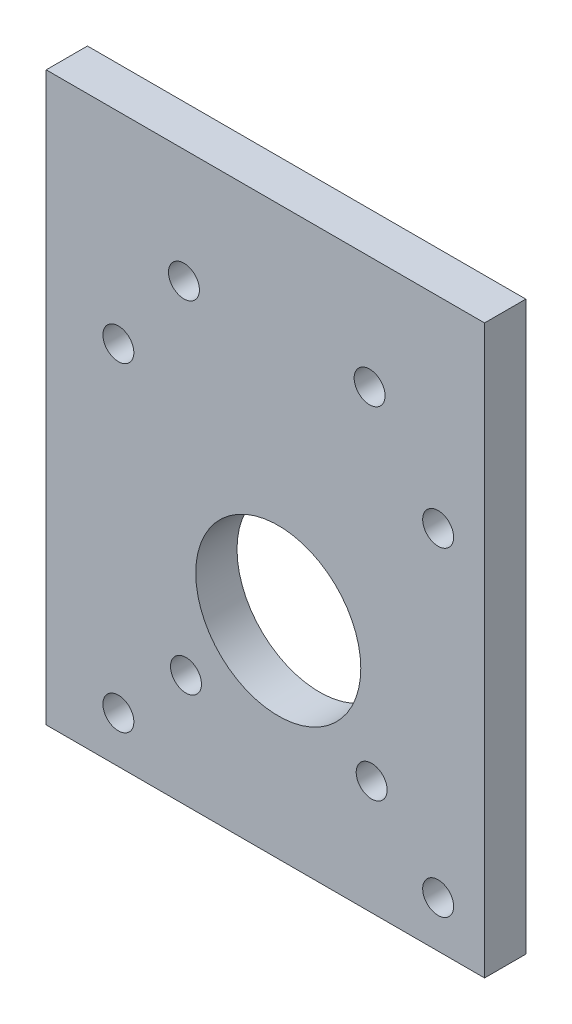
ISO-10303-21;
HEADER;
FILE_DESCRIPTION(('STEP AP214'),'2;1');
FILE_NAME('part.step','',(''),(''),'','','');
FILE_SCHEMA(('AUTOMOTIVE_DESIGN { 1 0 10303 214 1 1 1 1 }'));
ENDSEC;
DATA;
#1=APPLICATION_CONTEXT('core data for automotive mechanical design processes');
#2=APPLICATION_PROTOCOL_DEFINITION('international standard','automotive_design',2000,#1);
#3=PRODUCT_CONTEXT('',#1,'mechanical');
#4=PRODUCT('Part','Part','',(#3));
#5=PRODUCT_RELATED_PRODUCT_CATEGORY('part','',(#4));
#6=PRODUCT_DEFINITION_FORMATION('','',#4);
#7=PRODUCT_DEFINITION_CONTEXT('part definition',#1,'design');
#8=PRODUCT_DEFINITION('design','',#6,#7);
#9=PRODUCT_DEFINITION_SHAPE('','',#8);
#10=(LENGTH_UNIT() NAMED_UNIT(*) SI_UNIT(.MILLI.,.METRE.));
#11=(NAMED_UNIT(*) PLANE_ANGLE_UNIT() SI_UNIT($,.RADIAN.));
#12=(NAMED_UNIT(*) SI_UNIT($,.STERADIAN.) SOLID_ANGLE_UNIT());
#13=UNCERTAINTY_MEASURE_WITH_UNIT(LENGTH_MEASURE(1.E-05),#10,'distance_accuracy_value','');
#14=(GEOMETRIC_REPRESENTATION_CONTEXT(3) GLOBAL_UNCERTAINTY_ASSIGNED_CONTEXT((#13)) GLOBAL_UNIT_ASSIGNED_CONTEXT((#10,
#11,#12)) REPRESENTATION_CONTEXT('',''));
#15=CARTESIAN_POINT('',(0.,0.,0.));
#16=DIRECTION('',(0.,0.,1.));
#17=DIRECTION('',(1.,0.,0.));
#18=AXIS2_PLACEMENT_3D('',#15,#16,#17);
#19=CARTESIAN_POINT('',(21.25,20.,2.));
#20=DIRECTION('',(-1.,0.,0.));
#21=DIRECTION('',(0.,0.,1.));
#22=AXIS2_PLACEMENT_3D('',#19,#20,#21);
#23=PLANE('',#22);
#24=DIRECTION('',(0.,1.,0.));
#25=VECTOR('',#24,1.);
#26=CARTESIAN_POINT('',(21.25,20.,-2.));
#27=LINE('',#26,#25);
#28=CARTESIAN_POINT('',(21.25,-20.,-2.));
#29=VERTEX_POINT('',#28);
#30=CARTESIAN_POINT('',(21.25,35.,-2.));
#31=VERTEX_POINT('',#30);
#32=EDGE_CURVE('E153',#29,#31,#27,.T.);
#33=ORIENTED_EDGE('',*,*,#32,.T.);
#34=DIRECTION('',(0.,0.,-1.));
#35=VECTOR('',#34,1.);
#36=CARTESIAN_POINT('',(21.25,35.,-2.));
#37=LINE('',#36,#35);
#38=CARTESIAN_POINT('',(21.25,35.,2.));
#39=VERTEX_POINT('',#38);
#40=EDGE_CURVE('E99',#39,#31,#37,.T.);
#41=ORIENTED_EDGE('',*,*,#40,.F.);
#42=DIRECTION('',(0.,1.,0.));
#43=VECTOR('',#42,1.);
#44=CARTESIAN_POINT('',(21.25,20.,2.));
#45=LINE('',#44,#43);
#46=CARTESIAN_POINT('',(21.25,-20.,2.));
#47=VERTEX_POINT('',#46);
#48=EDGE_CURVE('E89',#47,#39,#45,.T.);
#49=ORIENTED_EDGE('',*,*,#48,.F.);
#50=DIRECTION('',(0.,0.,-1.));
#51=VECTOR('',#50,1.);
#52=CARTESIAN_POINT('',(21.25,-20.,2.));
#53=LINE('',#52,#51);
#54=EDGE_CURVE('E49',#47,#29,#53,.T.);
#55=ORIENTED_EDGE('',*,*,#54,.T.);
#56=EDGE_LOOP('',(#33,#41,#49,#55));
#57=FACE_BOUND('',#56,.T.);
#58=ADVANCED_FACE('F39',(#57),#23,.F.);
#59=CARTESIAN_POINT('',(-21.25,20.,2.));
#60=DIRECTION('',(1.,0.,0.));
#61=DIRECTION('',(0.,1.,0.));
#62=AXIS2_PLACEMENT_3D('',#59,#60,#61);
#63=PLANE('',#62);
#64=DIRECTION('',(0.,-1.,0.));
#65=VECTOR('',#64,1.);
#66=CARTESIAN_POINT('',(-21.25,20.,-2.));
#67=LINE('',#66,#65);
#68=CARTESIAN_POINT('',(-21.25,35.,-2.));
#69=VERTEX_POINT('',#68);
#70=CARTESIAN_POINT('',(-21.25,-20.,-2.));
#71=VERTEX_POINT('',#70);
#72=EDGE_CURVE('E69',#69,#71,#67,.T.);
#73=ORIENTED_EDGE('',*,*,#72,.T.);
#74=DIRECTION('',(0.,0.,-1.));
#75=VECTOR('',#74,1.);
#76=CARTESIAN_POINT('',(-21.25,-20.,2.));
#77=LINE('',#76,#75);
#78=CARTESIAN_POINT('',(-21.25,-20.,2.));
#79=VERTEX_POINT('',#78);
#80=EDGE_CURVE('E11',#79,#71,#77,.T.);
#81=ORIENTED_EDGE('',*,*,#80,.F.);
#82=DIRECTION('',(0.,-1.,0.));
#83=VECTOR('',#82,1.);
#84=CARTESIAN_POINT('',(-21.25,20.,2.));
#85=LINE('',#84,#83);
#86=CARTESIAN_POINT('',(-21.25,35.,2.));
#87=VERTEX_POINT('',#86);
#88=EDGE_CURVE('E83',#87,#79,#85,.T.);
#89=ORIENTED_EDGE('',*,*,#88,.F.);
#90=DIRECTION('',(0.,0.,1.));
#91=VECTOR('',#90,1.);
#92=CARTESIAN_POINT('',(-21.25,35.,-2.));
#93=LINE('',#92,#91);
#94=EDGE_CURVE('E87',#69,#87,#93,.T.);
#95=ORIENTED_EDGE('',*,*,#94,.F.);
#96=EDGE_LOOP('',(#73,#81,#89,#95));
#97=FACE_BOUND('',#96,.T.);
#98=ADVANCED_FACE('F85',(#97),#63,.F.);
#99=CARTESIAN_POINT('',(-21.25,-20.,2.));
#100=DIRECTION('',(0.,1.,0.));
#101=DIRECTION('',(0.,0.,1.));
#102=AXIS2_PLACEMENT_3D('',#99,#100,#101);
#103=PLANE('',#102);
#104=DIRECTION('',(1.,0.,0.));
#105=VECTOR('',#104,1.);
#106=CARTESIAN_POINT('',(-21.25,-20.,-2.));
#107=LINE('',#106,#105);
#108=EDGE_CURVE('E158',#71,#29,#107,.T.);
#109=ORIENTED_EDGE('',*,*,#108,.T.);
#110=ORIENTED_EDGE('',*,*,#54,.F.);
#111=DIRECTION('',(1.,0.,0.));
#112=VECTOR('',#111,1.);
#113=CARTESIAN_POINT('',(-21.25,-20.,2.));
#114=LINE('',#113,#112);
#115=EDGE_CURVE('E58',#79,#47,#114,.T.);
#116=ORIENTED_EDGE('',*,*,#115,.F.);
#117=ORIENTED_EDGE('',*,*,#80,.T.);
#118=EDGE_LOOP('',(#109,#110,#116,#117));
#119=FACE_BOUND('',#118,.T.);
#120=ADVANCED_FACE('F207',(#119),#103,.F.);
#121=CARTESIAN_POINT('',(0.,0.,2.));
#122=DIRECTION('',(0.,0.,1.));
#123=DIRECTION('',(1.,0.,0.));
#124=AXIS2_PLACEMENT_3D('',#121,#122,#123);
#125=PLANE('',#124);
#126=CARTESIAN_POINT('',(-7.69577181131252,-9.05390339576949,2.));
#127=DIRECTION('',(0.,0.,1.));
#128=DIRECTION('',(1.,0.,0.));
#129=AXIS2_PLACEMENT_3D('',#126,#127,#128);
#130=CIRCLE('',#129,1.5);
#131=CARTESIAN_POINT('',(-6.19577181131252,-9.05390339576949,2.));
#132=VERTEX_POINT('',#131);
#133=EDGE_CURVE('E371',#132,#132,#130,.T.);
#134=ORIENTED_EDGE('',*,*,#133,.F.);
#135=EDGE_LOOP('',(#134));
#136=FACE_BOUND('',#135,.T.);
#137=CARTESIAN_POINT('',(10.3039033957695,-8.94577181131251,2.));
#138=DIRECTION('',(0.,0.,1.));
#139=DIRECTION('',(1.,0.,0.));
#140=AXIS2_PLACEMENT_3D('',#137,#138,#139);
#141=CIRCLE('',#140,1.5);
#142=CARTESIAN_POINT('',(11.8039033957695,-8.94577181131251,2.));
#143=VERTEX_POINT('',#142);
#144=EDGE_CURVE('E367',#143,#143,#141,.T.);
#145=ORIENTED_EDGE('',*,*,#144,.F.);
#146=EDGE_LOOP('',(#145));
#147=FACE_BOUND('',#146,.T.);
#148=CARTESIAN_POINT('',(10.1056621575984,24.0536327350045,2.));
#149=DIRECTION('',(0.,0.,1.));
#150=DIRECTION('',(1.,0.,0.));
#151=AXIS2_PLACEMENT_3D('',#148,#149,#150);
#152=CIRCLE('',#151,1.5);
#153=CARTESIAN_POINT('',(11.6056621575984,24.0536327350045,2.));
#154=VERTEX_POINT('',#153);
#155=EDGE_CURVE('E364',#154,#154,#152,.T.);
#156=ORIENTED_EDGE('',*,*,#155,.F.);
#157=EDGE_LOOP('',(#156));
#158=FACE_BOUND('',#157,.T.);
#159=CARTESIAN_POINT('',(-7.89401304948366,23.9455011505475,2.));
#160=DIRECTION('',(0.,0.,1.));
#161=DIRECTION('',(1.,0.,0.));
#162=AXIS2_PLACEMENT_3D('',#159,#160,#161);
#163=CIRCLE('',#162,1.5);
#164=CARTESIAN_POINT('',(-6.39401304948366,23.9455011505475,2.));
#165=VERTEX_POINT('',#164);
#166=EDGE_CURVE('E109',#165,#165,#163,.T.);
#167=ORIENTED_EDGE('',*,*,#166,.F.);
#168=EDGE_LOOP('',(#167));
#169=FACE_BOUND('',#168,.T.);
#170=CARTESIAN_POINT('',(1.25,0.,2.));
#171=DIRECTION('',(0.,0.,1.));
#172=DIRECTION('',(1.,0.,0.));
#173=AXIS2_PLACEMENT_3D('',#170,#171,#172);
#174=CIRCLE('',#173,8.);
#175=CARTESIAN_POINT('',(9.25,0.,2.));
#176=VERTEX_POINT('',#175);
#177=EDGE_CURVE('E116',#176,#176,#174,.T.);
#178=ORIENTED_EDGE('',*,*,#177,.F.);
#179=EDGE_LOOP('',(#178));
#180=FACE_BOUND('',#179,.T.);
#181=CARTESIAN_POINT('',(16.75,-15.5,2.));
#182=DIRECTION('',(0.,0.,-1.));
#183=DIRECTION('',(-1.,0.,0.));
#184=AXIS2_PLACEMENT_3D('',#181,#182,#183);
#185=CIRCLE('',#184,1.5);
#186=CARTESIAN_POINT('',(15.25,-15.5,2.));
#187=VERTEX_POINT('',#186);
#188=EDGE_CURVE('E142',#187,#187,#185,.T.);
#189=ORIENTED_EDGE('',*,*,#188,.T.);
#190=EDGE_LOOP('',(#189));
#191=FACE_BOUND('',#190,.T.);
#192=CARTESIAN_POINT('',(-14.25,-15.5,2.));
#193=DIRECTION('',(0.,0.,-1.));
#194=DIRECTION('',(-1.,0.,0.));
#195=AXIS2_PLACEMENT_3D('',#192,#193,#194);
#196=CIRCLE('',#195,1.5);
#197=CARTESIAN_POINT('',(-15.75,-15.5,2.));
#198=VERTEX_POINT('',#197);
#199=EDGE_CURVE('E134',#198,#198,#196,.T.);
#200=ORIENTED_EDGE('',*,*,#199,.T.);
#201=EDGE_LOOP('',(#200));
#202=FACE_BOUND('',#201,.T.);
#203=CARTESIAN_POINT('',(-14.25,15.5,2.));
#204=DIRECTION('',(0.,0.,-1.));
#205=DIRECTION('',(-1.,0.,0.));
#206=AXIS2_PLACEMENT_3D('',#203,#204,#205);
#207=CIRCLE('',#206,1.5);
#208=CARTESIAN_POINT('',(-15.75,15.5,2.));
#209=VERTEX_POINT('',#208);
#210=EDGE_CURVE('E125',#209,#209,#207,.T.);
#211=ORIENTED_EDGE('',*,*,#210,.T.);
#212=EDGE_LOOP('',(#211));
#213=FACE_BOUND('',#212,.T.);
#214=CARTESIAN_POINT('',(16.75,15.5,2.));
#215=DIRECTION('',(0.,0.,-1.));
#216=DIRECTION('',(-1.,0.,0.));
#217=AXIS2_PLACEMENT_3D('',#214,#215,#216);
#218=CIRCLE('',#217,1.5);
#219=CARTESIAN_POINT('',(15.25,15.5,2.));
#220=VERTEX_POINT('',#219);
#221=EDGE_CURVE('E149',#220,#220,#218,.T.);
#222=ORIENTED_EDGE('',*,*,#221,.T.);
#223=EDGE_LOOP('',(#222));
#224=FACE_BOUND('',#223,.T.);
#225=ORIENTED_EDGE('',*,*,#48,.T.);
#226=DIRECTION('',(1.,0.,0.));
#227=VECTOR('',#226,1.);
#228=CARTESIAN_POINT('',(-21.25,35.,2.));
#229=LINE('',#228,#227);
#230=EDGE_CURVE('E92',#87,#39,#229,.T.);
#231=ORIENTED_EDGE('',*,*,#230,.F.);
#232=ORIENTED_EDGE('',*,*,#88,.T.);
#233=ORIENTED_EDGE('',*,*,#115,.T.);
#234=EDGE_LOOP('',(#225,#231,#232,#233));
#235=FACE_BOUND('',#234,.T.);
#236=ADVANCED_FACE('F93',(#136,#147,#158,#169,#180,#191,#202,#213,#224,#235),#125,.T.);
#237=CARTESIAN_POINT('',(0.,0.,-2.));
#238=DIRECTION('',(0.,0.,1.));
#239=DIRECTION('',(1.,0.,0.));
#240=AXIS2_PLACEMENT_3D('',#237,#238,#239);
#241=PLANE('',#240);
#242=CARTESIAN_POINT('',(-7.69577181131252,-9.05390339576949,-2.));
#243=DIRECTION('',(0.,0.,1.));
#244=DIRECTION('',(1.,0.,0.));
#245=AXIS2_PLACEMENT_3D('',#242,#243,#244);
#246=CIRCLE('',#245,1.5);
#247=CARTESIAN_POINT('',(-6.19577181131252,-9.05390339576949,-2.));
#248=VERTEX_POINT('',#247);
#249=EDGE_CURVE('E42',#248,#248,#246,.T.);
#250=ORIENTED_EDGE('',*,*,#249,.T.);
#251=EDGE_LOOP('',(#250));
#252=FACE_BOUND('',#251,.T.);
#253=CARTESIAN_POINT('',(10.3039033957695,-8.94577181131251,-2.));
#254=DIRECTION('',(0.,0.,1.));
#255=DIRECTION('',(1.,0.,0.));
#256=AXIS2_PLACEMENT_3D('',#253,#254,#255);
#257=CIRCLE('',#256,1.5);
#258=CARTESIAN_POINT('',(11.8039033957695,-8.94577181131251,-2.));
#259=VERTEX_POINT('',#258);
#260=EDGE_CURVE('E107',#259,#259,#257,.T.);
#261=ORIENTED_EDGE('',*,*,#260,.T.);
#262=EDGE_LOOP('',(#261));
#263=FACE_BOUND('',#262,.T.);
#264=CARTESIAN_POINT('',(10.1056621575984,24.0536327350045,-2.));
#265=DIRECTION('',(0.,0.,1.));
#266=DIRECTION('',(1.,0.,0.));
#267=AXIS2_PLACEMENT_3D('',#264,#265,#266);
#268=CIRCLE('',#267,1.5);
#269=CARTESIAN_POINT('',(11.6056621575984,24.0536327350045,-2.));
#270=VERTEX_POINT('',#269);
#271=EDGE_CURVE('E175',#270,#270,#268,.T.);
#272=ORIENTED_EDGE('',*,*,#271,.T.);
#273=EDGE_LOOP('',(#272));
#274=FACE_BOUND('',#273,.T.);
#275=CARTESIAN_POINT('',(-7.89401304948366,23.9455011505475,-2.));
#276=DIRECTION('',(0.,0.,1.));
#277=DIRECTION('',(1.,0.,0.));
#278=AXIS2_PLACEMENT_3D('',#275,#276,#277);
#279=CIRCLE('',#278,1.5);
#280=CARTESIAN_POINT('',(-6.39401304948366,23.9455011505475,-2.));
#281=VERTEX_POINT('',#280);
#282=EDGE_CURVE('E171',#281,#281,#279,.T.);
#283=ORIENTED_EDGE('',*,*,#282,.T.);
#284=EDGE_LOOP('',(#283));
#285=FACE_BOUND('',#284,.T.);
#286=CARTESIAN_POINT('',(1.25,0.,-2.));
#287=DIRECTION('',(0.,0.,1.));
#288=DIRECTION('',(1.,0.,0.));
#289=AXIS2_PLACEMENT_3D('',#286,#287,#288);
#290=CIRCLE('',#289,8.);
#291=CARTESIAN_POINT('',(9.25,0.,-2.));
#292=VERTEX_POINT('',#291);
#293=EDGE_CURVE('E117',#292,#292,#290,.T.);
#294=ORIENTED_EDGE('',*,*,#293,.T.);
#295=EDGE_LOOP('',(#294));
#296=FACE_BOUND('',#295,.T.);
#297=CARTESIAN_POINT('',(16.75,-15.5,-2.));
#298=DIRECTION('',(0.,0.,-1.));
#299=DIRECTION('',(-1.,0.,0.));
#300=AXIS2_PLACEMENT_3D('',#297,#298,#299);
#301=CIRCLE('',#300,1.5);
#302=CARTESIAN_POINT('',(15.25,-15.5,-2.));
#303=VERTEX_POINT('',#302);
#304=EDGE_CURVE('E121',#303,#303,#301,.T.);
#305=ORIENTED_EDGE('',*,*,#304,.F.);
#306=EDGE_LOOP('',(#305));
#307=FACE_BOUND('',#306,.T.);
#308=CARTESIAN_POINT('',(-14.25,-15.5,-2.));
#309=DIRECTION('',(0.,0.,-1.));
#310=DIRECTION('',(-1.,0.,0.));
#311=AXIS2_PLACEMENT_3D('',#308,#309,#310);
#312=CIRCLE('',#311,1.5);
#313=CARTESIAN_POINT('',(-15.75,-15.5,-2.));
#314=VERTEX_POINT('',#313);
#315=EDGE_CURVE('E138',#314,#314,#312,.T.);
#316=ORIENTED_EDGE('',*,*,#315,.F.);
#317=EDGE_LOOP('',(#316));
#318=FACE_BOUND('',#317,.T.);
#319=CARTESIAN_POINT('',(-14.25,15.5,-2.));
#320=DIRECTION('',(0.,0.,-1.));
#321=DIRECTION('',(-1.,0.,0.));
#322=AXIS2_PLACEMENT_3D('',#319,#320,#321);
#323=CIRCLE('',#322,1.5);
#324=CARTESIAN_POINT('',(-15.75,15.5,-2.));
#325=VERTEX_POINT('',#324);
#326=EDGE_CURVE('E130',#325,#325,#323,.T.);
#327=ORIENTED_EDGE('',*,*,#326,.F.);
#328=EDGE_LOOP('',(#327));
#329=FACE_BOUND('',#328,.T.);
#330=CARTESIAN_POINT('',(16.75,15.5,-2.));
#331=DIRECTION('',(0.,0.,-1.));
#332=DIRECTION('',(-1.,0.,0.));
#333=AXIS2_PLACEMENT_3D('',#330,#331,#332);
#334=CIRCLE('',#333,1.5);
#335=CARTESIAN_POINT('',(15.25,15.5,-2.));
#336=VERTEX_POINT('',#335);
#337=EDGE_CURVE('E129',#336,#336,#334,.T.);
#338=ORIENTED_EDGE('',*,*,#337,.F.);
#339=EDGE_LOOP('',(#338));
#340=FACE_BOUND('',#339,.T.);
#341=ORIENTED_EDGE('',*,*,#32,.F.);
#342=ORIENTED_EDGE('',*,*,#108,.F.);
#343=ORIENTED_EDGE('',*,*,#72,.F.);
#344=DIRECTION('',(-1.,0.,0.));
#345=VECTOR('',#344,1.);
#346=CARTESIAN_POINT('',(-21.25,35.,-2.));
#347=LINE('',#346,#345);
#348=EDGE_CURVE('E102',#31,#69,#347,.T.);
#349=ORIENTED_EDGE('',*,*,#348,.F.);
#350=EDGE_LOOP('',(#341,#342,#343,#349));
#351=FACE_BOUND('',#350,.T.);
#352=ADVANCED_FACE('F182',(#252,#263,#274,#285,#296,#307,#318,#329,#340,#351),#241,.F.);
#353=CARTESIAN_POINT('',(16.75,15.5,2.));
#354=DIRECTION('',(0.,0.,-1.));
#355=DIRECTION('',(-1.,0.,0.));
#356=AXIS2_PLACEMENT_3D('',#353,#354,#355);
#357=CYLINDRICAL_SURFACE('',#356,1.5);
#358=ORIENTED_EDGE('',*,*,#221,.F.);
#359=EDGE_LOOP('',(#358));
#360=FACE_BOUND('',#359,.T.);
#361=ORIENTED_EDGE('',*,*,#337,.T.);
#362=EDGE_LOOP('',(#361));
#363=FACE_BOUND('',#362,.T.);
#364=ADVANCED_FACE('F210',(#360,#363),#357,.F.);
#365=CARTESIAN_POINT('',(-14.25,15.5,2.));
#366=DIRECTION('',(0.,0.,-1.));
#367=DIRECTION('',(-1.,0.,0.));
#368=AXIS2_PLACEMENT_3D('',#365,#366,#367);
#369=CYLINDRICAL_SURFACE('',#368,1.5);
#370=ORIENTED_EDGE('',*,*,#210,.F.);
#371=EDGE_LOOP('',(#370));
#372=FACE_BOUND('',#371,.T.);
#373=ORIENTED_EDGE('',*,*,#326,.T.);
#374=EDGE_LOOP('',(#373));
#375=FACE_BOUND('',#374,.T.);
#376=ADVANCED_FACE('F217',(#372,#375),#369,.F.);
#377=CARTESIAN_POINT('',(-14.25,-15.5,2.));
#378=DIRECTION('',(0.,0.,-1.));
#379=DIRECTION('',(-1.,0.,0.));
#380=AXIS2_PLACEMENT_3D('',#377,#378,#379);
#381=CYLINDRICAL_SURFACE('',#380,1.5);
#382=ORIENTED_EDGE('',*,*,#199,.F.);
#383=EDGE_LOOP('',(#382));
#384=FACE_BOUND('',#383,.T.);
#385=ORIENTED_EDGE('',*,*,#315,.T.);
#386=EDGE_LOOP('',(#385));
#387=FACE_BOUND('',#386,.T.);
#388=ADVANCED_FACE('F244',(#384,#387),#381,.F.);
#389=CARTESIAN_POINT('',(16.75,-15.5,2.));
#390=DIRECTION('',(0.,0.,-1.));
#391=DIRECTION('',(-1.,0.,0.));
#392=AXIS2_PLACEMENT_3D('',#389,#390,#391);
#393=CYLINDRICAL_SURFACE('',#392,1.5);
#394=ORIENTED_EDGE('',*,*,#188,.F.);
#395=EDGE_LOOP('',(#394));
#396=FACE_BOUND('',#395,.T.);
#397=ORIENTED_EDGE('',*,*,#304,.T.);
#398=EDGE_LOOP('',(#397));
#399=FACE_BOUND('',#398,.T.);
#400=ADVANCED_FACE('F254',(#396,#399),#393,.F.);
#401=CARTESIAN_POINT('',(1.25,0.,-2.));
#402=DIRECTION('',(0.,0.,1.));
#403=DIRECTION('',(1.,0.,0.));
#404=AXIS2_PLACEMENT_3D('',#401,#402,#403);
#405=CYLINDRICAL_SURFACE('',#404,8.);
#406=ORIENTED_EDGE('',*,*,#293,.F.);
#407=EDGE_LOOP('',(#406));
#408=FACE_BOUND('',#407,.T.);
#409=ORIENTED_EDGE('',*,*,#177,.T.);
#410=EDGE_LOOP('',(#409));
#411=FACE_BOUND('',#410,.T.);
#412=ADVANCED_FACE('F264',(#408,#411),#405,.F.);
#413=CARTESIAN_POINT('',(0.,35.,0.));
#414=DIRECTION('',(0.,1.,0.));
#415=DIRECTION('',(0.,0.,1.));
#416=AXIS2_PLACEMENT_3D('',#413,#414,#415);
#417=PLANE('',#416);
#418=ORIENTED_EDGE('',*,*,#94,.T.);
#419=ORIENTED_EDGE('',*,*,#230,.T.);
#420=ORIENTED_EDGE('',*,*,#40,.T.);
#421=ORIENTED_EDGE('',*,*,#348,.T.);
#422=EDGE_LOOP('',(#418,#419,#420,#421));
#423=FACE_BOUND('',#422,.T.);
#424=ADVANCED_FACE('F101',(#423),#417,.T.);
#425=CARTESIAN_POINT('',(-7.89401304948366,23.9455011505475,-8.));
#426=DIRECTION('',(0.,0.,1.));
#427=DIRECTION('',(1.,0.,0.));
#428=AXIS2_PLACEMENT_3D('',#425,#426,#427);
#429=CYLINDRICAL_SURFACE('',#428,1.5);
#430=ORIENTED_EDGE('',*,*,#166,.T.);
#431=EDGE_LOOP('',(#430));
#432=FACE_BOUND('',#431,.T.);
#433=ORIENTED_EDGE('',*,*,#282,.F.);
#434=EDGE_LOOP('',(#433));
#435=FACE_BOUND('',#434,.T.);
#436=ADVANCED_FACE('F197',(#432,#435),#429,.F.);
#437=CARTESIAN_POINT('',(10.1056621575984,24.0536327350045,-8.));
#438=DIRECTION('',(0.,0.,1.));
#439=DIRECTION('',(1.,0.,0.));
#440=AXIS2_PLACEMENT_3D('',#437,#438,#439);
#441=CYLINDRICAL_SURFACE('',#440,1.5);
#442=ORIENTED_EDGE('',*,*,#155,.T.);
#443=EDGE_LOOP('',(#442));
#444=FACE_BOUND('',#443,.T.);
#445=ORIENTED_EDGE('',*,*,#271,.F.);
#446=EDGE_LOOP('',(#445));
#447=FACE_BOUND('',#446,.T.);
#448=ADVANCED_FACE('F188',(#444,#447),#441,.F.);
#449=CARTESIAN_POINT('',(10.3039033957695,-8.94577181131251,-8.));
#450=DIRECTION('',(0.,0.,1.));
#451=DIRECTION('',(1.,0.,0.));
#452=AXIS2_PLACEMENT_3D('',#449,#450,#451);
#453=CYLINDRICAL_SURFACE('',#452,1.5);
#454=ORIENTED_EDGE('',*,*,#144,.T.);
#455=EDGE_LOOP('',(#454));
#456=FACE_BOUND('',#455,.T.);
#457=ORIENTED_EDGE('',*,*,#260,.F.);
#458=EDGE_LOOP('',(#457));
#459=FACE_BOUND('',#458,.T.);
#460=ADVANCED_FACE('F185',(#456,#459),#453,.F.);
#461=CARTESIAN_POINT('',(-7.69577181131252,-9.05390339576949,-8.));
#462=DIRECTION('',(0.,0.,1.));
#463=DIRECTION('',(1.,0.,0.));
#464=AXIS2_PLACEMENT_3D('',#461,#462,#463);
#465=CYLINDRICAL_SURFACE('',#464,1.5);
#466=ORIENTED_EDGE('',*,*,#133,.T.);
#467=EDGE_LOOP('',(#466));
#468=FACE_BOUND('',#467,.T.);
#469=ORIENTED_EDGE('',*,*,#249,.F.);
#470=EDGE_LOOP('',(#469));
#471=FACE_BOUND('',#470,.T.);
#472=ADVANCED_FACE('F187',(#468,#471),#465,.F.);
#473=CLOSED_SHELL('',(#58,#98,#120,#236,#352,#364,#376,#388,#400,#412,#424,#436,#448,#460,#472));
#474=MANIFOLD_SOLID_BREP('B2',#473);
#475=ADVANCED_BREP_SHAPE_REPRESENTATION('',(#18,#474),#14);
#476=SHAPE_DEFINITION_REPRESENTATION(#9,#475);
ENDSEC;
END-ISO-10303-21;
